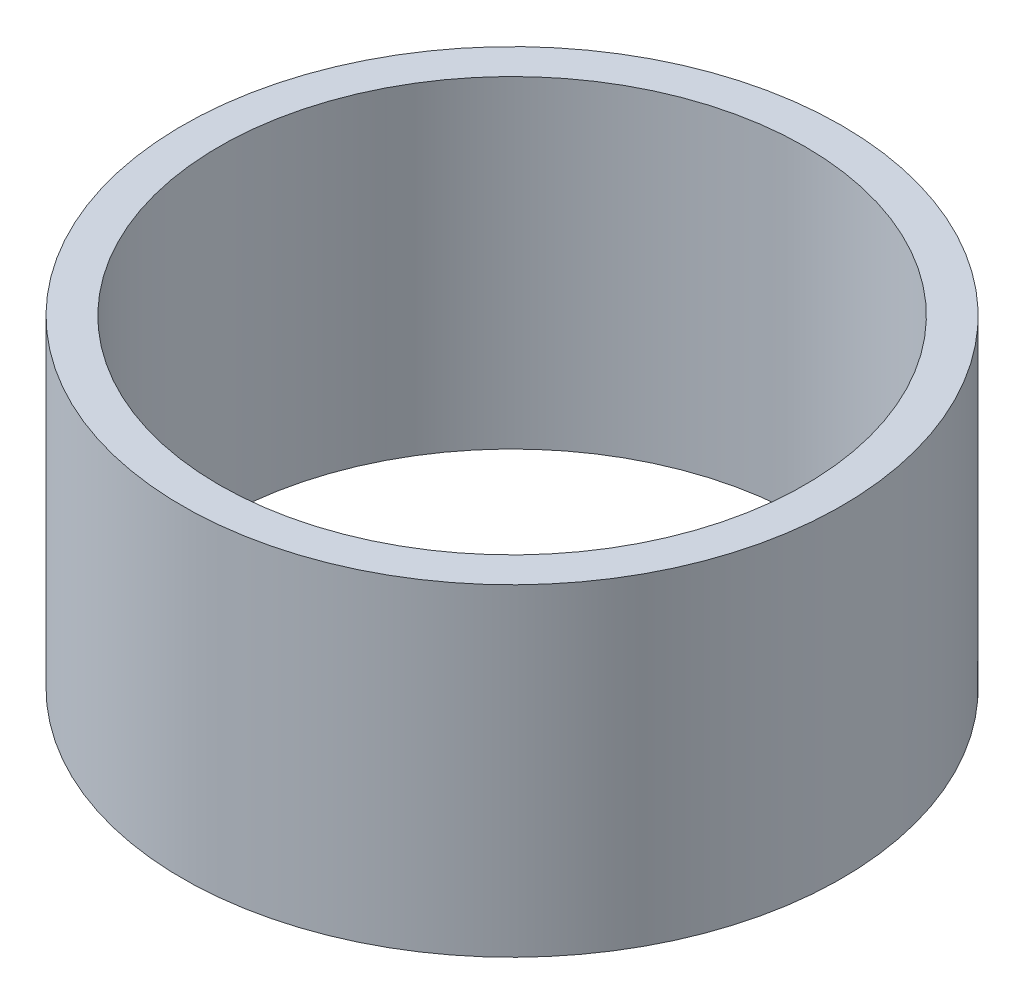
ISO-10303-21;
HEADER;
FILE_DESCRIPTION(('STEP AP214'),'2;1');
FILE_NAME('part.step','',(''),(''),'','','');
FILE_SCHEMA(('AUTOMOTIVE_DESIGN { 1 0 10303 214 1 1 1 1 }'));
ENDSEC;
DATA;
#1=APPLICATION_CONTEXT('core data for automotive mechanical design processes');
#2=APPLICATION_PROTOCOL_DEFINITION('international standard','automotive_design',2000,#1);
#3=PRODUCT_CONTEXT('',#1,'mechanical');
#4=PRODUCT('Part','Part','',(#3));
#5=PRODUCT_RELATED_PRODUCT_CATEGORY('part','',(#4));
#6=PRODUCT_DEFINITION_FORMATION('','',#4);
#7=PRODUCT_DEFINITION_CONTEXT('part definition',#1,'design');
#8=PRODUCT_DEFINITION('design','',#6,#7);
#9=PRODUCT_DEFINITION_SHAPE('','',#8);
#10=(LENGTH_UNIT() NAMED_UNIT(*) SI_UNIT(.MILLI.,.METRE.));
#11=(NAMED_UNIT(*) PLANE_ANGLE_UNIT() SI_UNIT($,.RADIAN.));
#12=(NAMED_UNIT(*) SI_UNIT($,.STERADIAN.) SOLID_ANGLE_UNIT());
#13=UNCERTAINTY_MEASURE_WITH_UNIT(LENGTH_MEASURE(1.E-05),#10,'distance_accuracy_value','');
#14=(GEOMETRIC_REPRESENTATION_CONTEXT(3) GLOBAL_UNCERTAINTY_ASSIGNED_CONTEXT((#13)) GLOBAL_UNIT_ASSIGNED_CONTEXT((#10,
#11,#12)) REPRESENTATION_CONTEXT('',''));
#15=CARTESIAN_POINT('',(0.,0.,0.));
#16=DIRECTION('',(0.,0.,1.));
#17=DIRECTION('',(1.,0.,0.));
#18=AXIS2_PLACEMENT_3D('',#15,#16,#17);
#19=CARTESIAN_POINT('',(0.,0.,0.));
#20=DIRECTION('',(0.,-1.,0.));
#21=DIRECTION('',(0.,0.,-1.));
#22=AXIS2_PLACEMENT_3D('',#19,#20,#21);
#23=CYLINDRICAL_SURFACE('',#22,12.7);
#24=CARTESIAN_POINT('',(0.,0.,0.));
#25=DIRECTION('',(0.,-1.,0.));
#26=DIRECTION('',(0.,0.,-1.));
#27=AXIS2_PLACEMENT_3D('',#24,#25,#26);
#28=CIRCLE('',#27,12.7);
#29=CARTESIAN_POINT('',(0.,0.,-12.7));
#30=VERTEX_POINT('',#29);
#31=EDGE_CURVE('E47',#30,#30,#28,.T.);
#32=ORIENTED_EDGE('',*,*,#31,.T.);
#33=EDGE_LOOP('',(#32));
#34=FACE_BOUND('',#33,.T.);
#35=CARTESIAN_POINT('',(0.,13.98499997,0.));
#36=DIRECTION('',(0.,-1.,0.));
#37=DIRECTION('',(0.,0.,-1.));
#38=AXIS2_PLACEMENT_3D('',#35,#36,#37);
#39=CIRCLE('',#38,12.7);
#40=CARTESIAN_POINT('',(0.,13.98499997,-12.7));
#41=VERTEX_POINT('',#40);
#42=EDGE_CURVE('E10',#41,#41,#39,.T.);
#43=ORIENTED_EDGE('',*,*,#42,.F.);
#44=EDGE_LOOP('',(#43));
#45=FACE_BOUND('',#44,.T.);
#46=ADVANCED_FACE('F33',(#34,#45),#23,.F.);
#47=CARTESIAN_POINT('',(0.,13.98499997,-12.7));
#48=DIRECTION('',(0.,1.,0.));
#49=DIRECTION('',(0.,0.,1.));
#50=AXIS2_PLACEMENT_3D('',#47,#48,#49);
#51=PLANE('',#50);
#52=ORIENTED_EDGE('',*,*,#42,.T.);
#53=EDGE_LOOP('',(#52));
#54=FACE_BOUND('',#53,.T.);
#55=CARTESIAN_POINT('',(0.,13.98499997,0.));
#56=DIRECTION('',(0.,-1.,0.));
#57=DIRECTION('',(0.,0.,-1.));
#58=AXIS2_PLACEMENT_3D('',#55,#56,#57);
#59=CIRCLE('',#58,14.2875);
#60=CARTESIAN_POINT('',(0.,13.98499997,-14.2875));
#61=VERTEX_POINT('',#60);
#62=EDGE_CURVE('E39',#61,#61,#59,.T.);
#63=ORIENTED_EDGE('',*,*,#62,.F.);
#64=EDGE_LOOP('',(#63));
#65=FACE_BOUND('',#64,.T.);
#66=ADVANCED_FACE('F63',(#54,#65),#51,.T.);
#67=CARTESIAN_POINT('',(0.,0.,0.));
#68=DIRECTION('',(0.,-1.,0.));
#69=DIRECTION('',(0.,0.,-1.));
#70=AXIS2_PLACEMENT_3D('',#67,#68,#69);
#71=CYLINDRICAL_SURFACE('',#70,14.2875);
#72=ORIENTED_EDGE('',*,*,#62,.T.);
#73=EDGE_LOOP('',(#72));
#74=FACE_BOUND('',#73,.T.);
#75=CARTESIAN_POINT('',(0.,0.,0.));
#76=DIRECTION('',(0.,-1.,0.));
#77=DIRECTION('',(0.,0.,-1.));
#78=AXIS2_PLACEMENT_3D('',#75,#76,#77);
#79=CIRCLE('',#78,14.2875);
#80=CARTESIAN_POINT('',(0.,0.,-14.2875));
#81=VERTEX_POINT('',#80);
#82=EDGE_CURVE('E43',#81,#81,#79,.T.);
#83=ORIENTED_EDGE('',*,*,#82,.F.);
#84=EDGE_LOOP('',(#83));
#85=FACE_BOUND('',#84,.T.);
#86=ADVANCED_FACE('F57',(#74,#85),#71,.T.);
#87=CARTESIAN_POINT('',(0.,0.,-12.7));
#88=DIRECTION('',(0.,-1.,0.));
#89=DIRECTION('',(0.,0.,-1.));
#90=AXIS2_PLACEMENT_3D('',#87,#88,#89);
#91=PLANE('',#90);
#92=ORIENTED_EDGE('',*,*,#82,.T.);
#93=EDGE_LOOP('',(#92));
#94=FACE_BOUND('',#93,.T.);
#95=ORIENTED_EDGE('',*,*,#31,.F.);
#96=EDGE_LOOP('',(#95));
#97=FACE_BOUND('',#96,.T.);
#98=ADVANCED_FACE('F55',(#94,#97),#91,.T.);
#99=CLOSED_SHELL('',(#46,#66,#86,#98));
#100=MANIFOLD_SOLID_BREP('B2',#99);
#101=ADVANCED_BREP_SHAPE_REPRESENTATION('',(#18,#100),#14);
#102=SHAPE_DEFINITION_REPRESENTATION(#9,#101);
ENDSEC;
END-ISO-10303-21;
